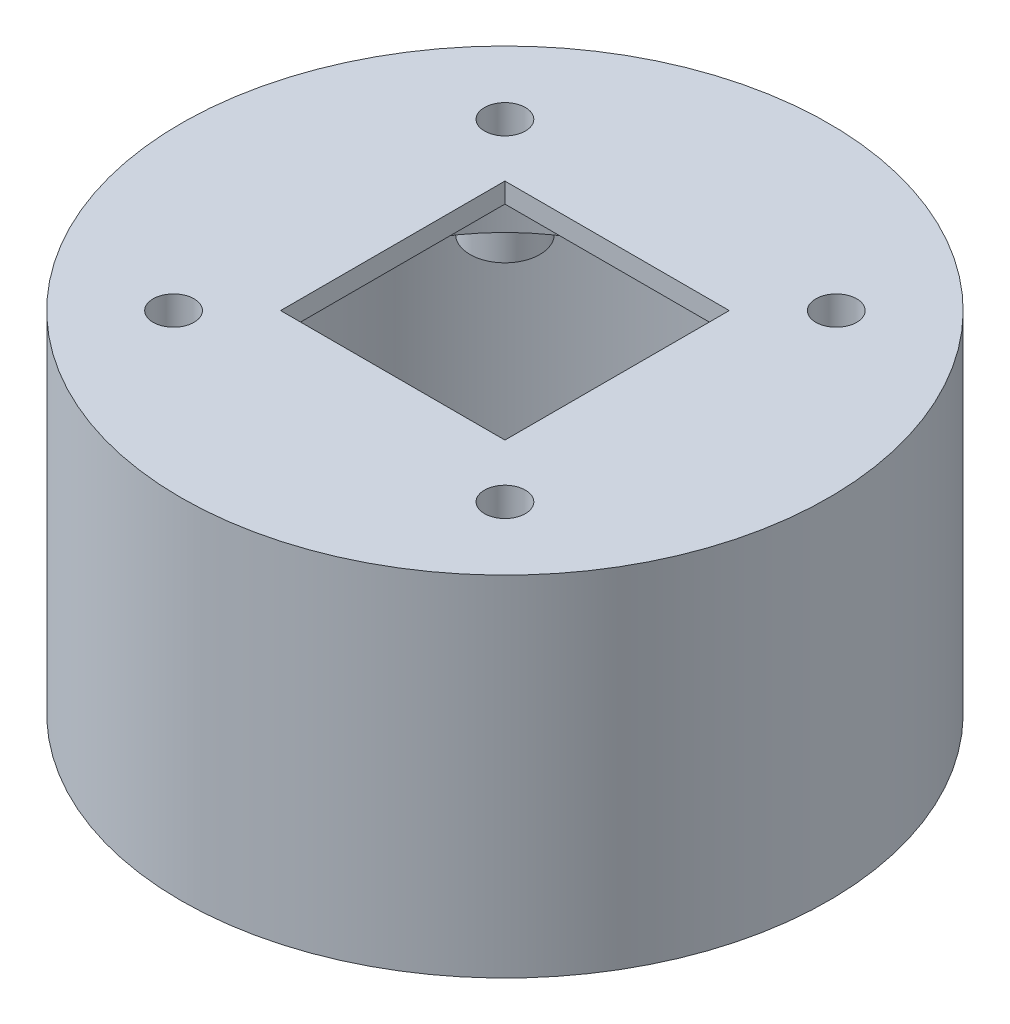
ISO-10303-21;
HEADER;
FILE_DESCRIPTION(('STEP AP214'),'2;1');
FILE_NAME('part.step','',(''),(''),'','','');
FILE_SCHEMA(('AUTOMOTIVE_DESIGN { 1 0 10303 214 1 1 1 1 }'));
ENDSEC;
DATA;
#1=APPLICATION_CONTEXT('core data for automotive mechanical design processes');
#2=APPLICATION_PROTOCOL_DEFINITION('international standard','automotive_design',2000,#1);
#3=PRODUCT_CONTEXT('',#1,'mechanical');
#4=PRODUCT('Part','Part','',(#3));
#5=PRODUCT_RELATED_PRODUCT_CATEGORY('part','',(#4));
#6=PRODUCT_DEFINITION_FORMATION('','',#4);
#7=PRODUCT_DEFINITION_CONTEXT('part definition',#1,'design');
#8=PRODUCT_DEFINITION('design','',#6,#7);
#9=PRODUCT_DEFINITION_SHAPE('','',#8);
#10=(LENGTH_UNIT() NAMED_UNIT(*) SI_UNIT(.MILLI.,.METRE.));
#11=(NAMED_UNIT(*) PLANE_ANGLE_UNIT() SI_UNIT($,.RADIAN.));
#12=(NAMED_UNIT(*) SI_UNIT($,.STERADIAN.) SOLID_ANGLE_UNIT());
#13=UNCERTAINTY_MEASURE_WITH_UNIT(LENGTH_MEASURE(1.E-05),#10,'distance_accuracy_value','');
#14=(GEOMETRIC_REPRESENTATION_CONTEXT(3) GLOBAL_UNCERTAINTY_ASSIGNED_CONTEXT((#13)) GLOBAL_UNIT_ASSIGNED_CONTEXT((#10,
#11,#12)) REPRESENTATION_CONTEXT('',''));
#15=CARTESIAN_POINT('',(0.,0.,0.));
#16=DIRECTION('',(0.,0.,1.));
#17=DIRECTION('',(1.,0.,0.));
#18=AXIS2_PLACEMENT_3D('',#15,#16,#17);
#19=CARTESIAN_POINT('',(22.5,0.,-22.5));
#20=DIRECTION('',(0.,0.,-1.));
#21=DIRECTION('',(-1.,0.,0.));
#22=AXIS2_PLACEMENT_3D('',#19,#20,#21);
#23=PLANE('',#22);
#24=DIRECTION('',(-1.,0.,0.));
#25=VECTOR('',#24,1.);
#26=CARTESIAN_POINT('',(22.5,66.,-22.5));
#27=LINE('',#26,#25);
#28=CARTESIAN_POINT('',(22.5,66.,-22.5));
#29=VERTEX_POINT('',#28);
#30=CARTESIAN_POINT('',(-22.5,66.,-22.5));
#31=VERTEX_POINT('',#30);
#32=EDGE_CURVE('E387',#29,#31,#27,.T.);
#33=ORIENTED_EDGE('',*,*,#32,.F.);
#34=DIRECTION('',(0.,1.,0.));
#35=VECTOR('',#34,1.);
#36=CARTESIAN_POINT('',(22.5,0.,-22.5));
#37=LINE('',#36,#35);
#38=CARTESIAN_POINT('',(22.5,70.,-22.5));
#39=VERTEX_POINT('',#38);
#40=EDGE_CURVE('E248',#29,#39,#37,.T.);
#41=ORIENTED_EDGE('',*,*,#40,.T.);
#42=DIRECTION('',(-1.,0.,0.));
#43=VECTOR('',#42,1.);
#44=CARTESIAN_POINT('',(22.5,70.,-22.5));
#45=LINE('',#44,#43);
#46=CARTESIAN_POINT('',(-22.5,70.,-22.5));
#47=VERTEX_POINT('',#46);
#48=EDGE_CURVE('E243',#39,#47,#45,.T.);
#49=ORIENTED_EDGE('',*,*,#48,.T.);
#50=DIRECTION('',(0.,1.,0.));
#51=VECTOR('',#50,1.);
#52=CARTESIAN_POINT('',(-22.5,0.,-22.5));
#53=LINE('',#52,#51);
#54=EDGE_CURVE('E234',#31,#47,#53,.T.);
#55=ORIENTED_EDGE('',*,*,#54,.F.);
#56=EDGE_LOOP('',(#33,#41,#49,#55));
#57=FACE_BOUND('',#56,.T.);
#58=ADVANCED_FACE('F35',(#57),#23,.F.);
#59=CARTESIAN_POINT('',(22.5,0.,22.5));
#60=DIRECTION('',(0.,0.,1.));
#61=DIRECTION('',(1.,0.,0.));
#62=AXIS2_PLACEMENT_3D('',#59,#60,#61);
#63=PLANE('',#62);
#64=DIRECTION('',(1.,0.,0.));
#65=VECTOR('',#64,1.);
#66=CARTESIAN_POINT('',(22.5,66.,22.5));
#67=LINE('',#66,#65);
#68=CARTESIAN_POINT('',(-22.5,66.,22.5));
#69=VERTEX_POINT('',#68);
#70=CARTESIAN_POINT('',(22.5,66.,22.5));
#71=VERTEX_POINT('',#70);
#72=EDGE_CURVE('E49',#69,#71,#67,.T.);
#73=ORIENTED_EDGE('',*,*,#72,.F.);
#74=DIRECTION('',(0.,1.,0.));
#75=VECTOR('',#74,1.);
#76=CARTESIAN_POINT('',(-22.5,0.,22.5));
#77=LINE('',#76,#75);
#78=CARTESIAN_POINT('',(-22.5,70.,22.5));
#79=VERTEX_POINT('',#78);
#80=EDGE_CURVE('E246',#69,#79,#77,.T.);
#81=ORIENTED_EDGE('',*,*,#80,.T.);
#82=DIRECTION('',(1.,0.,0.));
#83=VECTOR('',#82,1.);
#84=CARTESIAN_POINT('',(22.5,70.,22.5));
#85=LINE('',#84,#83);
#86=CARTESIAN_POINT('',(22.5,70.,22.5));
#87=VERTEX_POINT('',#86);
#88=EDGE_CURVE('E237',#79,#87,#85,.T.);
#89=ORIENTED_EDGE('',*,*,#88,.T.);
#90=DIRECTION('',(0.,1.,0.));
#91=VECTOR('',#90,1.);
#92=CARTESIAN_POINT('',(22.5,0.,22.5));
#93=LINE('',#92,#91);
#94=EDGE_CURVE('E250',#71,#87,#93,.T.);
#95=ORIENTED_EDGE('',*,*,#94,.F.);
#96=EDGE_LOOP('',(#73,#81,#89,#95));
#97=FACE_BOUND('',#96,.T.);
#98=ADVANCED_FACE('F404',(#97),#63,.F.);
#99=CARTESIAN_POINT('',(-22.5,0.,-22.5));
#100=DIRECTION('',(-1.,0.,0.));
#101=DIRECTION('',(0.,0.,1.));
#102=AXIS2_PLACEMENT_3D('',#99,#100,#101);
#103=PLANE('',#102);
#104=DIRECTION('',(0.,0.,1.));
#105=VECTOR('',#104,1.);
#106=CARTESIAN_POINT('',(-22.5,66.,-22.5));
#107=LINE('',#106,#105);
#108=EDGE_CURVE('E383',#31,#69,#107,.T.);
#109=ORIENTED_EDGE('',*,*,#108,.F.);
#110=ORIENTED_EDGE('',*,*,#54,.T.);
#111=DIRECTION('',(0.,0.,1.));
#112=VECTOR('',#111,1.);
#113=CARTESIAN_POINT('',(-22.5,70.,-22.5));
#114=LINE('',#113,#112);
#115=EDGE_CURVE('E221',#47,#79,#114,.T.);
#116=ORIENTED_EDGE('',*,*,#115,.T.);
#117=ORIENTED_EDGE('',*,*,#80,.F.);
#118=EDGE_LOOP('',(#109,#110,#116,#117));
#119=FACE_BOUND('',#118,.T.);
#120=ADVANCED_FACE('F410',(#119),#103,.F.);
#121=CARTESIAN_POINT('',(22.5,0.,-22.5));
#122=DIRECTION('',(1.,0.,0.));
#123=DIRECTION('',(0.,0.,-1.));
#124=AXIS2_PLACEMENT_3D('',#121,#122,#123);
#125=PLANE('',#124);
#126=DIRECTION('',(0.,0.,-1.));
#127=VECTOR('',#126,1.);
#128=CARTESIAN_POINT('',(22.5,66.,-22.5));
#129=LINE('',#128,#127);
#130=EDGE_CURVE('E11',#71,#29,#129,.T.);
#131=ORIENTED_EDGE('',*,*,#130,.F.);
#132=ORIENTED_EDGE('',*,*,#94,.T.);
#133=DIRECTION('',(0.,0.,-1.));
#134=VECTOR('',#133,1.);
#135=CARTESIAN_POINT('',(22.5,70.,-22.5));
#136=LINE('',#135,#134);
#137=EDGE_CURVE('E240',#87,#39,#136,.T.);
#138=ORIENTED_EDGE('',*,*,#137,.T.);
#139=ORIENTED_EDGE('',*,*,#40,.F.);
#140=EDGE_LOOP('',(#131,#132,#138,#139));
#141=FACE_BOUND('',#140,.T.);
#142=ADVANCED_FACE('F419',(#141),#125,.F.);
#143=CARTESIAN_POINT('',(0.,56.,0.));
#144=DIRECTION('',(0.,-1.,0.));
#145=DIRECTION('',(0.,0.,-1.));
#146=AXIS2_PLACEMENT_3D('',#143,#144,#145);
#147=PLANE('',#146);
#148=CARTESIAN_POINT('',(0.,56.,0.));
#149=DIRECTION('',(0.,-1.,0.));
#150=DIRECTION('',(0.,0.,-1.));
#151=AXIS2_PLACEMENT_3D('',#148,#149,#150);
#152=CIRCLE('',#151,39.);
#153=CARTESIAN_POINT('',(-22.5,56.,31.855140872393));
#154=VERTEX_POINT('',#153);
#155=CARTESIAN_POINT('',(22.5,56.,31.855140872393));
#156=VERTEX_POINT('',#155);
#157=EDGE_CURVE('E169',#154,#156,#152,.T.);
#158=ORIENTED_EDGE('',*,*,#157,.F.);
#159=DIRECTION('',(0.,0.,1.));
#160=VECTOR('',#159,1.);
#161=CARTESIAN_POINT('',(-22.5,56.,-22.5));
#162=LINE('',#161,#160);
#163=CARTESIAN_POINT('',(-22.5,56.,44.6514277487294));
#164=VERTEX_POINT('',#163);
#165=EDGE_CURVE('E191',#154,#164,#162,.T.);
#166=ORIENTED_EDGE('',*,*,#165,.T.);
#167=CARTESIAN_POINT('',(0.,56.,0.));
#168=DIRECTION('',(0.,-1.,0.));
#169=DIRECTION('',(0.,0.,-1.));
#170=AXIS2_PLACEMENT_3D('',#167,#168,#169);
#171=CIRCLE('',#170,50.);
#172=CARTESIAN_POINT('',(-30.4516111412089,56.,39.6572739721808));
#173=VERTEX_POINT('',#172);
#174=EDGE_CURVE('E349',#164,#173,#171,.T.);
#175=ORIENTED_EDGE('',*,*,#174,.T.);
#176=CARTESIAN_POINT('',(-33.2340187157677,56.,33.2340187157677));
#177=DIRECTION('',(0.,-1.,0.));
#178=DIRECTION('',(0.,0.,-1.));
#179=AXIS2_PLACEMENT_3D('',#176,#177,#178);
#180=CIRCLE('',#179,7.);
#181=CARTESIAN_POINT('',(-39.6572739721807,56.,30.4516111412089));
#182=VERTEX_POINT('',#181);
#183=EDGE_CURVE('E365',#182,#173,#180,.T.);
#184=ORIENTED_EDGE('',*,*,#183,.F.);
#185=CARTESIAN_POINT('',(-39.6572739721807,56.,-30.4516111412089));
#186=VERTEX_POINT('',#185);
#187=EDGE_CURVE('E198',#182,#186,#171,.T.);
#188=ORIENTED_EDGE('',*,*,#187,.T.);
#189=CARTESIAN_POINT('',(-33.2340187157677,56.,-33.2340187157677));
#190=DIRECTION('',(0.,-1.,0.));
#191=DIRECTION('',(0.,0.,-1.));
#192=AXIS2_PLACEMENT_3D('',#189,#190,#191);
#193=CIRCLE('',#192,7.);
#194=CARTESIAN_POINT('',(-30.4516111412089,56.,-39.6572739721807));
#195=VERTEX_POINT('',#194);
#196=EDGE_CURVE('E356',#195,#186,#193,.T.);
#197=ORIENTED_EDGE('',*,*,#196,.F.);
#198=CARTESIAN_POINT('',(30.4516111412089,56.,-39.6572739721808));
#199=VERTEX_POINT('',#198);
#200=EDGE_CURVE('E334',#195,#199,#171,.T.);
#201=ORIENTED_EDGE('',*,*,#200,.T.);
#202=CARTESIAN_POINT('',(33.2340187157677,56.,-33.2340187157677));
#203=DIRECTION('',(0.,-1.,0.));
#204=DIRECTION('',(0.,0.,-1.));
#205=AXIS2_PLACEMENT_3D('',#202,#203,#204);
#206=CIRCLE('',#205,7.);
#207=CARTESIAN_POINT('',(39.6572739721807,56.,-30.4516111412089));
#208=VERTEX_POINT('',#207);
#209=EDGE_CURVE('E372',#208,#199,#206,.T.);
#210=ORIENTED_EDGE('',*,*,#209,.F.);
#211=CARTESIAN_POINT('',(39.6572739721808,56.,30.4516111412089));
#212=VERTEX_POINT('',#211);
#213=EDGE_CURVE('E192',#208,#212,#171,.T.);
#214=ORIENTED_EDGE('',*,*,#213,.T.);
#215=CARTESIAN_POINT('',(33.2340187157677,56.,33.2340187157677));
#216=DIRECTION('',(0.,-1.,0.));
#217=DIRECTION('',(0.,0.,-1.));
#218=AXIS2_PLACEMENT_3D('',#215,#216,#217);
#219=CIRCLE('',#218,7.);
#220=CARTESIAN_POINT('',(30.4516111412089,56.,39.6572739721807));
#221=VERTEX_POINT('',#220);
#222=EDGE_CURVE('E380',#221,#212,#219,.T.);
#223=ORIENTED_EDGE('',*,*,#222,.F.);
#224=CARTESIAN_POINT('',(22.5,56.,44.6514277487294));
#225=VERTEX_POINT('',#224);
#226=EDGE_CURVE('E189',#221,#225,#171,.T.);
#227=ORIENTED_EDGE('',*,*,#226,.T.);
#228=DIRECTION('',(0.,0.,-1.));
#229=VECTOR('',#228,1.);
#230=CARTESIAN_POINT('',(22.5,56.,-22.5));
#231=LINE('',#230,#229);
#232=EDGE_CURVE('E183',#225,#156,#231,.T.);
#233=ORIENTED_EDGE('',*,*,#232,.T.);
#234=EDGE_LOOP('',(#158,#166,#175,#184,#188,#197,#201,#210,#214,#223,#227,#233));
#235=FACE_BOUND('',#234,.T.);
#236=ADVANCED_FACE('F187',(#235),#147,.T.);
#237=CARTESIAN_POINT('',(0.,56.,0.));
#238=DIRECTION('',(0.,-1.,0.));
#239=DIRECTION('',(0.,0.,-1.));
#240=AXIS2_PLACEMENT_3D('',#237,#238,#239);
#241=CYLINDRICAL_SURFACE('',#240,50.);
#242=DIRECTION('',(0.,1.,0.));
#243=VECTOR('',#242,1.);
#244=CARTESIAN_POINT('',(39.6572739721808,53.,30.4516111412089));
#245=LINE('',#244,#243);
#246=CARTESIAN_POINT('',(39.6572739721807,50.,30.4516111412089));
#247=VERTEX_POINT('',#246);
#248=EDGE_CURVE('E376',#212,#247,#245,.F.);
#249=ORIENTED_EDGE('',*,*,#248,.F.);
#250=ORIENTED_EDGE('',*,*,#213,.F.);
#251=DIRECTION('',(0.,1.,0.));
#252=VECTOR('',#251,1.);
#253=CARTESIAN_POINT('',(39.6572739721807,53.,-30.4516111412089));
#254=LINE('',#253,#252);
#255=CARTESIAN_POINT('',(39.6572739721807,50.,-30.4516111412089));
#256=VERTEX_POINT('',#255);
#257=EDGE_CURVE('E295',#256,#208,#254,.T.);
#258=ORIENTED_EDGE('',*,*,#257,.F.);
#259=CARTESIAN_POINT('',(0.,50.,0.));
#260=DIRECTION('',(0.,-1.,0.));
#261=DIRECTION('',(0.,0.,-1.));
#262=AXIS2_PLACEMENT_3D('',#259,#260,#261);
#263=CIRCLE('',#262,50.);
#264=EDGE_CURVE('E329',#256,#247,#263,.T.);
#265=ORIENTED_EDGE('',*,*,#264,.T.);
#266=EDGE_LOOP('',(#249,#250,#258,#265));
#267=FACE_BOUND('',#266,.T.);
#268=ADVANCED_FACE('F459',(#267),#241,.F.);
#269=DIRECTION('',(0.,1.,0.));
#270=VECTOR('',#269,1.);
#271=CARTESIAN_POINT('',(30.4516111412089,53.,39.6572739721807));
#272=LINE('',#271,#270);
#273=CARTESIAN_POINT('',(30.4516111412089,50.,39.6572739721807));
#274=VERTEX_POINT('',#273);
#275=EDGE_CURVE('E298',#274,#221,#272,.T.);
#276=ORIENTED_EDGE('',*,*,#275,.F.);
#277=CARTESIAN_POINT('',(22.5,50.,44.6514277487294));
#278=VERTEX_POINT('',#277);
#279=EDGE_CURVE('E328',#274,#278,#263,.T.);
#280=ORIENTED_EDGE('',*,*,#279,.T.);
#281=DIRECTION('',(0.,-1.,0.));
#282=VECTOR('',#281,1.);
#283=CARTESIAN_POINT('',(22.5,56.,44.6514277487294));
#284=LINE('',#283,#282);
#285=EDGE_CURVE('E194',#225,#278,#284,.T.);
#286=ORIENTED_EDGE('',*,*,#285,.F.);
#287=ORIENTED_EDGE('',*,*,#226,.F.);
#288=EDGE_LOOP('',(#276,#280,#286,#287));
#289=FACE_BOUND('',#288,.T.);
#290=ADVANCED_FACE('F342',(#289),#241,.F.);
#291=DIRECTION('',(0.,1.,0.));
#292=VECTOR('',#291,1.);
#293=CARTESIAN_POINT('',(30.4516111412089,53.,-39.6572739721808));
#294=LINE('',#293,#292);
#295=CARTESIAN_POINT('',(30.4516111412089,50.,-39.6572739721807));
#296=VERTEX_POINT('',#295);
#297=EDGE_CURVE('E367',#199,#296,#294,.F.);
#298=ORIENTED_EDGE('',*,*,#297,.F.);
#299=ORIENTED_EDGE('',*,*,#200,.F.);
#300=DIRECTION('',(0.,1.,0.));
#301=VECTOR('',#300,1.);
#302=CARTESIAN_POINT('',(-30.4516111412089,53.,-39.6572739721808));
#303=LINE('',#302,#301);
#304=CARTESIAN_POINT('',(-30.4516111412089,50.,-39.6572739721807));
#305=VERTEX_POINT('',#304);
#306=EDGE_CURVE('E353',#305,#195,#303,.T.);
#307=ORIENTED_EDGE('',*,*,#306,.F.);
#308=EDGE_CURVE('E200',#305,#296,#263,.T.);
#309=ORIENTED_EDGE('',*,*,#308,.T.);
#310=EDGE_LOOP('',(#298,#299,#307,#309));
#311=FACE_BOUND('',#310,.T.);
#312=ADVANCED_FACE('F448',(#311),#241,.F.);
#313=DIRECTION('',(0.,1.,0.));
#314=VECTOR('',#313,1.);
#315=CARTESIAN_POINT('',(-39.6572739721807,53.,30.4516111412089));
#316=LINE('',#315,#314);
#317=CARTESIAN_POINT('',(-39.6572739721807,50.,30.4516111412089));
#318=VERTEX_POINT('',#317);
#319=EDGE_CURVE('E360',#318,#182,#316,.T.);
#320=ORIENTED_EDGE('',*,*,#319,.F.);
#321=CARTESIAN_POINT('',(-39.6572739721807,50.,-30.4516111412089));
#322=VERTEX_POINT('',#321);
#323=EDGE_CURVE('E327',#318,#322,#263,.T.);
#324=ORIENTED_EDGE('',*,*,#323,.T.);
#325=DIRECTION('',(0.,1.,0.));
#326=VECTOR('',#325,1.);
#327=CARTESIAN_POINT('',(-39.6572739721807,53.,-30.4516111412089));
#328=LINE('',#327,#326);
#329=EDGE_CURVE('E333',#186,#322,#328,.F.);
#330=ORIENTED_EDGE('',*,*,#329,.F.);
#331=ORIENTED_EDGE('',*,*,#187,.F.);
#332=EDGE_LOOP('',(#320,#324,#330,#331));
#333=FACE_BOUND('',#332,.T.);
#334=ADVANCED_FACE('F446',(#333),#241,.F.);
#335=DIRECTION('',(0.,1.,0.));
#336=VECTOR('',#335,1.);
#337=CARTESIAN_POINT('',(-30.4516111412089,53.,39.6572739721808));
#338=LINE('',#337,#336);
#339=CARTESIAN_POINT('',(-30.4516111412089,50.,39.6572739721807));
#340=VERTEX_POINT('',#339);
#341=EDGE_CURVE('E292',#173,#340,#338,.F.);
#342=ORIENTED_EDGE('',*,*,#341,.F.);
#343=ORIENTED_EDGE('',*,*,#174,.F.);
#344=DIRECTION('',(0.,-1.,0.));
#345=VECTOR('',#344,1.);
#346=CARTESIAN_POINT('',(-22.5,56.,44.6514277487294));
#347=LINE('',#346,#345);
#348=CARTESIAN_POINT('',(-22.5,50.,44.6514277487294));
#349=VERTEX_POINT('',#348);
#350=EDGE_CURVE('E203',#349,#164,#347,.F.);
#351=ORIENTED_EDGE('',*,*,#350,.F.);
#352=EDGE_CURVE('E321',#349,#340,#263,.T.);
#353=ORIENTED_EDGE('',*,*,#352,.T.);
#354=EDGE_LOOP('',(#342,#343,#351,#353));
#355=FACE_BOUND('',#354,.T.);
#356=ADVANCED_FACE('F439',(#355),#241,.F.);
#357=CARTESIAN_POINT('',(0.,0.,0.));
#358=DIRECTION('',(0.,1.,0.));
#359=DIRECTION('',(0.,0.,1.));
#360=AXIS2_PLACEMENT_3D('',#357,#358,#359);
#361=PLANE('',#360);
#362=CARTESIAN_POINT('',(0.,0.,0.));
#363=DIRECTION('',(0.,1.,0.));
#364=DIRECTION('',(0.,0.,1.));
#365=AXIS2_PLACEMENT_3D('',#362,#363,#364);
#366=CIRCLE('',#365,65.);
#367=CARTESIAN_POINT('',(0.,0.,65.));
#368=VERTEX_POINT('',#367);
#369=EDGE_CURVE('E281',#368,#368,#366,.T.);
#370=ORIENTED_EDGE('',*,*,#369,.F.);
#371=EDGE_LOOP('',(#370));
#372=FACE_BOUND('',#371,.T.);
#373=CARTESIAN_POINT('',(0.,0.,0.));
#374=DIRECTION('',(0.,1.,0.));
#375=DIRECTION('',(0.,0.,1.));
#376=AXIS2_PLACEMENT_3D('',#373,#374,#375);
#377=CIRCLE('',#376,60.);
#378=CARTESIAN_POINT('',(0.,0.,60.));
#379=VERTEX_POINT('',#378);
#380=EDGE_CURVE('E278',#379,#379,#377,.T.);
#381=ORIENTED_EDGE('',*,*,#380,.T.);
#382=EDGE_LOOP('',(#381));
#383=FACE_BOUND('',#382,.T.);
#384=ADVANCED_FACE('F437',(#372,#383),#361,.F.);
#385=CARTESIAN_POINT('',(0.,50.,0.));
#386=DIRECTION('',(0.,-1.,0.));
#387=DIRECTION('',(0.,0.,-1.));
#388=AXIS2_PLACEMENT_3D('',#385,#386,#387);
#389=CYLINDRICAL_SURFACE('',#388,65.);
#390=ORIENTED_EDGE('',*,*,#369,.T.);
#391=EDGE_LOOP('',(#390));
#392=FACE_BOUND('',#391,.T.);
#393=CARTESIAN_POINT('',(0.,70.,0.));
#394=DIRECTION('',(0.,1.,0.));
#395=DIRECTION('',(0.,0.,1.));
#396=AXIS2_PLACEMENT_3D('',#393,#394,#395);
#397=CIRCLE('',#396,65.);
#398=CARTESIAN_POINT('',(0.,70.,65.));
#399=VERTEX_POINT('',#398);
#400=EDGE_CURVE('E272',#399,#399,#397,.T.);
#401=ORIENTED_EDGE('',*,*,#400,.F.);
#402=EDGE_LOOP('',(#401));
#403=FACE_BOUND('',#402,.T.);
#404=ADVANCED_FACE('F37',(#392,#403),#389,.T.);
#405=CARTESIAN_POINT('',(0.,50.,0.));
#406=DIRECTION('',(0.,-1.,0.));
#407=DIRECTION('',(0.,0.,-1.));
#408=AXIS2_PLACEMENT_3D('',#405,#406,#407);
#409=CYLINDRICAL_SURFACE('',#408,60.);
#410=CARTESIAN_POINT('',(0.,50.,0.));
#411=DIRECTION('',(0.,1.,0.));
#412=DIRECTION('',(0.,0.,1.));
#413=AXIS2_PLACEMENT_3D('',#410,#411,#412);
#414=CIRCLE('',#413,60.);
#415=CARTESIAN_POINT('',(0.,50.,60.));
#416=VERTEX_POINT('',#415);
#417=EDGE_CURVE('E275',#416,#416,#414,.T.);
#418=ORIENTED_EDGE('',*,*,#417,.T.);
#419=EDGE_LOOP('',(#418));
#420=FACE_BOUND('',#419,.T.);
#421=ORIENTED_EDGE('',*,*,#380,.F.);
#422=EDGE_LOOP('',(#421));
#423=FACE_BOUND('',#422,.T.);
#424=ADVANCED_FACE('F433',(#420,#423),#409,.F.);
#425=CARTESIAN_POINT('',(0.,50.,0.));
#426=DIRECTION('',(0.,1.,0.));
#427=DIRECTION('',(0.,0.,1.));
#428=AXIS2_PLACEMENT_3D('',#425,#426,#427);
#429=PLANE('',#428);
#430=CARTESIAN_POINT('',(33.2340187157677,50.,33.2340187157677));
#431=DIRECTION('',(0.,1.,0.));
#432=DIRECTION('',(0.,0.,1.));
#433=AXIS2_PLACEMENT_3D('',#430,#431,#432);
#434=CIRCLE('',#433,4.1);
#435=CARTESIAN_POINT('',(33.2340187157677,50.,37.3340187157677));
#436=VERTEX_POINT('',#435);
#437=EDGE_CURVE('E257',#436,#436,#434,.T.);
#438=ORIENTED_EDGE('',*,*,#437,.T.);
#439=EDGE_LOOP('',(#438));
#440=FACE_BOUND('',#439,.T.);
#441=CARTESIAN_POINT('',(33.2340187157677,50.,33.2340187157677));
#442=DIRECTION('',(0.,1.,0.));
#443=DIRECTION('',(0.,0.,1.));
#444=AXIS2_PLACEMENT_3D('',#441,#442,#443);
#445=CIRCLE('',#444,7.);
#446=EDGE_CURVE('E381',#247,#274,#445,.T.);
#447=ORIENTED_EDGE('',*,*,#446,.F.);
#448=ORIENTED_EDGE('',*,*,#264,.F.);
#449=CARTESIAN_POINT('',(33.2340187157677,50.,-33.2340187157677));
#450=DIRECTION('',(0.,1.,0.));
#451=DIRECTION('',(0.,0.,1.));
#452=AXIS2_PLACEMENT_3D('',#449,#450,#451);
#453=CIRCLE('',#452,7.);
#454=EDGE_CURVE('E373',#296,#256,#453,.T.);
#455=ORIENTED_EDGE('',*,*,#454,.F.);
#456=ORIENTED_EDGE('',*,*,#308,.F.);
#457=CARTESIAN_POINT('',(-33.2340187157677,50.,-33.2340187157677));
#458=DIRECTION('',(0.,1.,0.));
#459=DIRECTION('',(0.,0.,1.));
#460=AXIS2_PLACEMENT_3D('',#457,#458,#459);
#461=CIRCLE('',#460,7.);
#462=EDGE_CURVE('E357',#322,#305,#461,.T.);
#463=ORIENTED_EDGE('',*,*,#462,.F.);
#464=ORIENTED_EDGE('',*,*,#323,.F.);
#465=CARTESIAN_POINT('',(-33.2340187157677,50.,33.2340187157677));
#466=DIRECTION('',(0.,1.,0.));
#467=DIRECTION('',(0.,0.,1.));
#468=AXIS2_PLACEMENT_3D('',#465,#466,#467);
#469=CIRCLE('',#468,7.);
#470=EDGE_CURVE('E324',#340,#318,#469,.T.);
#471=ORIENTED_EDGE('',*,*,#470,.F.);
#472=ORIENTED_EDGE('',*,*,#352,.F.);
#473=DIRECTION('',(0.,0.,1.));
#474=VECTOR('',#473,1.);
#475=CARTESIAN_POINT('',(-22.5,50.,0.));
#476=LINE('',#475,#474);
#477=CARTESIAN_POINT('',(-22.5,50.,47.5));
#478=VERTEX_POINT('',#477);
#479=EDGE_CURVE('E255',#349,#478,#476,.T.);
#480=ORIENTED_EDGE('',*,*,#479,.T.);
#481=DIRECTION('',(-1.,0.,0.));
#482=VECTOR('',#481,1.);
#483=CARTESIAN_POINT('',(-22.5,50.,47.5));
#484=LINE('',#483,#482);
#485=CARTESIAN_POINT('',(-15.612494995996,50.,47.5));
#486=VERTEX_POINT('',#485);
#487=EDGE_CURVE('E206',#486,#478,#484,.T.);
#488=ORIENTED_EDGE('',*,*,#487,.F.);
#489=CARTESIAN_POINT('',(15.612494995996,50.,47.5));
#490=VERTEX_POINT('',#489);
#491=EDGE_CURVE('E326',#490,#486,#263,.T.);
#492=ORIENTED_EDGE('',*,*,#491,.F.);
#493=CARTESIAN_POINT('',(22.5,50.,47.5));
#494=VERTEX_POINT('',#493);
#495=EDGE_CURVE('E209',#494,#490,#484,.T.);
#496=ORIENTED_EDGE('',*,*,#495,.F.);
#497=DIRECTION('',(0.,0.,-1.));
#498=VECTOR('',#497,1.);
#499=CARTESIAN_POINT('',(22.5,50.,0.));
#500=LINE('',#499,#498);
#501=EDGE_CURVE('E227',#494,#278,#500,.T.);
#502=ORIENTED_EDGE('',*,*,#501,.T.);
#503=ORIENTED_EDGE('',*,*,#279,.F.);
#504=EDGE_LOOP('',(#447,#448,#455,#456,#463,#464,#471,#472,#480,#488,#492,#496,#502,#503));
#505=FACE_BOUND('',#504,.T.);
#506=CARTESIAN_POINT('',(-33.2340187157677,50.,33.2340187157677));
#507=DIRECTION('',(0.,1.,0.));
#508=DIRECTION('',(0.,0.,1.));
#509=AXIS2_PLACEMENT_3D('',#506,#507,#508);
#510=CIRCLE('',#509,4.1);
#511=CARTESIAN_POINT('',(-33.2340187157677,50.,37.3340187157677));
#512=VERTEX_POINT('',#511);
#513=EDGE_CURVE('E269',#512,#512,#510,.T.);
#514=ORIENTED_EDGE('',*,*,#513,.T.);
#515=EDGE_LOOP('',(#514));
#516=FACE_BOUND('',#515,.T.);
#517=ORIENTED_EDGE('',*,*,#417,.F.);
#518=EDGE_LOOP('',(#517));
#519=FACE_BOUND('',#518,.T.);
#520=CARTESIAN_POINT('',(-33.2340187157677,50.,-33.2340187157677));
#521=DIRECTION('',(0.,1.,0.));
#522=DIRECTION('',(0.,0.,1.));
#523=AXIS2_PLACEMENT_3D('',#520,#521,#522);
#524=CIRCLE('',#523,4.1);
#525=CARTESIAN_POINT('',(-33.2340187157677,50.,-29.1340187157677));
#526=VERTEX_POINT('',#525);
#527=EDGE_CURVE('E263',#526,#526,#524,.T.);
#528=ORIENTED_EDGE('',*,*,#527,.T.);
#529=EDGE_LOOP('',(#528));
#530=FACE_BOUND('',#529,.T.);
#531=CARTESIAN_POINT('',(33.2340187157677,50.,-33.2340187157677));
#532=DIRECTION('',(0.,1.,0.));
#533=DIRECTION('',(0.,0.,1.));
#534=AXIS2_PLACEMENT_3D('',#531,#532,#533);
#535=CIRCLE('',#534,4.1);
#536=CARTESIAN_POINT('',(33.2340187157677,50.,-29.1340187157677));
#537=VERTEX_POINT('',#536);
#538=EDGE_CURVE('E260',#537,#537,#535,.T.);
#539=ORIENTED_EDGE('',*,*,#538,.T.);
#540=EDGE_LOOP('',(#539));
#541=FACE_BOUND('',#540,.T.);
#542=ADVANCED_FACE('F317',(#440,#505,#516,#519,#530,#541),#429,.F.);
#543=CARTESIAN_POINT('',(0.,70.,0.));
#544=DIRECTION('',(0.,1.,0.));
#545=DIRECTION('',(0.,0.,1.));
#546=AXIS2_PLACEMENT_3D('',#543,#544,#545);
#547=PLANE('',#546);
#548=CARTESIAN_POINT('',(-33.2340187157677,70.,-33.2340187157677));
#549=DIRECTION('',(0.,1.,0.));
#550=DIRECTION('',(0.,0.,1.));
#551=AXIS2_PLACEMENT_3D('',#548,#549,#550);
#552=CIRCLE('',#551,4.1);
#553=CARTESIAN_POINT('',(-33.2340187157677,70.,-29.1340187157677));
#554=VERTEX_POINT('',#553);
#555=EDGE_CURVE('E224',#554,#554,#552,.T.);
#556=ORIENTED_EDGE('',*,*,#555,.F.);
#557=EDGE_LOOP('',(#556));
#558=FACE_BOUND('',#557,.T.);
#559=CARTESIAN_POINT('',(33.2340187157677,70.,-33.2340187157677));
#560=DIRECTION('',(0.,1.,0.));
#561=DIRECTION('',(0.,0.,1.));
#562=AXIS2_PLACEMENT_3D('',#559,#560,#561);
#563=CIRCLE('',#562,4.1);
#564=CARTESIAN_POINT('',(33.2340187157677,70.,-29.1340187157677));
#565=VERTEX_POINT('',#564);
#566=EDGE_CURVE('E228',#565,#565,#563,.T.);
#567=ORIENTED_EDGE('',*,*,#566,.F.);
#568=EDGE_LOOP('',(#567));
#569=FACE_BOUND('',#568,.T.);
#570=CARTESIAN_POINT('',(33.2340187157677,70.,33.2340187157677));
#571=DIRECTION('',(0.,1.,0.));
#572=DIRECTION('',(0.,0.,1.));
#573=AXIS2_PLACEMENT_3D('',#570,#571,#572);
#574=CIRCLE('',#573,4.1);
#575=CARTESIAN_POINT('',(33.2340187157677,70.,37.3340187157677));
#576=VERTEX_POINT('',#575);
#577=EDGE_CURVE('E231',#576,#576,#574,.T.);
#578=ORIENTED_EDGE('',*,*,#577,.F.);
#579=EDGE_LOOP('',(#578));
#580=FACE_BOUND('',#579,.T.);
#581=ORIENTED_EDGE('',*,*,#115,.F.);
#582=ORIENTED_EDGE('',*,*,#48,.F.);
#583=ORIENTED_EDGE('',*,*,#137,.F.);
#584=ORIENTED_EDGE('',*,*,#88,.F.);
#585=EDGE_LOOP('',(#581,#582,#583,#584));
#586=FACE_BOUND('',#585,.T.);
#587=CARTESIAN_POINT('',(-33.2340187157677,70.,33.2340187157677));
#588=DIRECTION('',(0.,1.,0.));
#589=DIRECTION('',(0.,0.,1.));
#590=AXIS2_PLACEMENT_3D('',#587,#588,#589);
#591=CIRCLE('',#590,4.1);
#592=CARTESIAN_POINT('',(-33.2340187157677,70.,37.3340187157677));
#593=VERTEX_POINT('',#592);
#594=EDGE_CURVE('E266',#593,#593,#591,.T.);
#595=ORIENTED_EDGE('',*,*,#594,.F.);
#596=EDGE_LOOP('',(#595));
#597=FACE_BOUND('',#596,.T.);
#598=ORIENTED_EDGE('',*,*,#400,.T.);
#599=EDGE_LOOP('',(#598));
#600=FACE_BOUND('',#599,.T.);
#601=ADVANCED_FACE('F426',(#558,#569,#580,#586,#597,#600),#547,.T.);
#602=CARTESIAN_POINT('',(-33.2340187157677,0.,33.2340187157677));
#603=DIRECTION('',(0.,1.,0.));
#604=DIRECTION('',(0.,0.,1.));
#605=AXIS2_PLACEMENT_3D('',#602,#603,#604);
#606=CYLINDRICAL_SURFACE('',#605,4.1);
#607=ORIENTED_EDGE('',*,*,#513,.F.);
#608=EDGE_LOOP('',(#607));
#609=FACE_BOUND('',#608,.T.);
#610=ORIENTED_EDGE('',*,*,#594,.T.);
#611=EDGE_LOOP('',(#610));
#612=FACE_BOUND('',#611,.T.);
#613=ADVANCED_FACE('F423',(#609,#612),#606,.F.);
#614=ORIENTED_EDGE('',*,*,#165,.F.);
#615=DIRECTION('',(0.,-1.,0.));
#616=VECTOR('',#615,1.);
#617=CARTESIAN_POINT('',(-22.5,66.,31.855140872393));
#618=LINE('',#617,#616);
#619=CARTESIAN_POINT('',(-22.5,65.,31.855140872393));
#620=VERTEX_POINT('',#619);
#621=EDGE_CURVE('E172',#154,#620,#618,.F.);
#622=ORIENTED_EDGE('',*,*,#621,.T.);
#623=DIRECTION('',(0.,0.,-1.));
#624=VECTOR('',#623,1.);
#625=CARTESIAN_POINT('',(-22.5,65.,47.5));
#626=LINE('',#625,#624);
#627=CARTESIAN_POINT('',(-22.5,65.,47.5));
#628=VERTEX_POINT('',#627);
#629=EDGE_CURVE('E212',#628,#620,#626,.T.);
#630=ORIENTED_EDGE('',*,*,#629,.F.);
#631=DIRECTION('',(0.,-1.,0.));
#632=VECTOR('',#631,1.);
#633=CARTESIAN_POINT('',(-22.5,65.,47.5));
#634=LINE('',#633,#632);
#635=EDGE_CURVE('E218',#628,#478,#634,.T.);
#636=ORIENTED_EDGE('',*,*,#635,.T.);
#637=ORIENTED_EDGE('',*,*,#479,.F.);
#638=ORIENTED_EDGE('',*,*,#350,.T.);
#639=EDGE_LOOP('',(#614,#622,#630,#636,#637,#638));
#640=FACE_BOUND('',#639,.T.);
#641=ADVANCED_FACE('F303',(#640),#103,.F.);
#642=DIRECTION('',(0.,0.,1.));
#643=VECTOR('',#642,1.);
#644=CARTESIAN_POINT('',(22.5,65.,47.5));
#645=LINE('',#644,#643);
#646=CARTESIAN_POINT('',(22.5,65.,31.855140872393));
#647=VERTEX_POINT('',#646);
#648=CARTESIAN_POINT('',(22.5,65.,47.5));
#649=VERTEX_POINT('',#648);
#650=EDGE_CURVE('E185',#647,#649,#645,.T.);
#651=ORIENTED_EDGE('',*,*,#650,.F.);
#652=DIRECTION('',(0.,-1.,0.));
#653=VECTOR('',#652,1.);
#654=CARTESIAN_POINT('',(22.5,66.,31.855140872393));
#655=LINE('',#654,#653);
#656=EDGE_CURVE('E57',#647,#156,#655,.T.);
#657=ORIENTED_EDGE('',*,*,#656,.T.);
#658=ORIENTED_EDGE('',*,*,#232,.F.);
#659=ORIENTED_EDGE('',*,*,#285,.T.);
#660=ORIENTED_EDGE('',*,*,#501,.F.);
#661=DIRECTION('',(0.,-1.,0.));
#662=VECTOR('',#661,1.);
#663=CARTESIAN_POINT('',(22.5,65.,47.5));
#664=LINE('',#663,#662);
#665=EDGE_CURVE('E215',#649,#494,#664,.T.);
#666=ORIENTED_EDGE('',*,*,#665,.F.);
#667=EDGE_LOOP('',(#651,#657,#658,#659,#660,#666));
#668=FACE_BOUND('',#667,.T.);
#669=ADVANCED_FACE('F181',(#668),#125,.F.);
#670=CARTESIAN_POINT('',(33.2340187157677,0.,33.2340187157677));
#671=DIRECTION('',(0.,1.,0.));
#672=DIRECTION('',(0.,0.,1.));
#673=AXIS2_PLACEMENT_3D('',#670,#671,#672);
#674=CYLINDRICAL_SURFACE('',#673,4.1);
#675=ORIENTED_EDGE('',*,*,#437,.F.);
#676=EDGE_LOOP('',(#675));
#677=FACE_BOUND('',#676,.T.);
#678=ORIENTED_EDGE('',*,*,#577,.T.);
#679=EDGE_LOOP('',(#678));
#680=FACE_BOUND('',#679,.T.);
#681=ADVANCED_FACE('F416',(#677,#680),#674,.F.);
#682=CARTESIAN_POINT('',(33.2340187157677,0.,-33.2340187157677));
#683=DIRECTION('',(0.,1.,0.));
#684=DIRECTION('',(0.,0.,1.));
#685=AXIS2_PLACEMENT_3D('',#682,#683,#684);
#686=CYLINDRICAL_SURFACE('',#685,4.1);
#687=ORIENTED_EDGE('',*,*,#538,.F.);
#688=EDGE_LOOP('',(#687));
#689=FACE_BOUND('',#688,.T.);
#690=ORIENTED_EDGE('',*,*,#566,.T.);
#691=EDGE_LOOP('',(#690));
#692=FACE_BOUND('',#691,.T.);
#693=ADVANCED_FACE('F508',(#689,#692),#686,.F.);
#694=CARTESIAN_POINT('',(-33.2340187157677,0.,-33.2340187157677));
#695=DIRECTION('',(0.,1.,0.));
#696=DIRECTION('',(0.,0.,1.));
#697=AXIS2_PLACEMENT_3D('',#694,#695,#696);
#698=CYLINDRICAL_SURFACE('',#697,4.1);
#699=ORIENTED_EDGE('',*,*,#527,.F.);
#700=EDGE_LOOP('',(#699));
#701=FACE_BOUND('',#700,.T.);
#702=ORIENTED_EDGE('',*,*,#555,.T.);
#703=EDGE_LOOP('',(#702));
#704=FACE_BOUND('',#703,.T.);
#705=ADVANCED_FACE('F504',(#701,#704),#698,.F.);
#706=CARTESIAN_POINT('',(-22.5,65.,47.5));
#707=DIRECTION('',(0.,0.,1.));
#708=DIRECTION('',(1.,0.,0.));
#709=AXIS2_PLACEMENT_3D('',#706,#707,#708);
#710=PLANE('',#709);
#711=DIRECTION('',(1.,0.,0.));
#712=VECTOR('',#711,1.);
#713=CARTESIAN_POINT('',(-22.5,56.,47.5));
#714=LINE('',#713,#712);
#715=CARTESIAN_POINT('',(-15.612494995996,56.,47.5));
#716=VERTEX_POINT('',#715);
#717=CARTESIAN_POINT('',(15.612494995996,56.,47.5));
#718=VERTEX_POINT('',#717);
#719=EDGE_CURVE('E284',#716,#718,#714,.T.);
#720=ORIENTED_EDGE('',*,*,#719,.F.);
#721=DIRECTION('',(0.,-1.,0.));
#722=VECTOR('',#721,1.);
#723=CARTESIAN_POINT('',(-15.6124949959961,56.,47.5));
#724=LINE('',#723,#722);
#725=EDGE_CURVE('E289',#716,#486,#724,.T.);
#726=ORIENTED_EDGE('',*,*,#725,.T.);
#727=ORIENTED_EDGE('',*,*,#487,.T.);
#728=ORIENTED_EDGE('',*,*,#635,.F.);
#729=DIRECTION('',(-1.,0.,0.));
#730=VECTOR('',#729,1.);
#731=CARTESIAN_POINT('',(-22.5,65.,47.5));
#732=LINE('',#731,#730);
#733=EDGE_CURVE('E208',#649,#628,#732,.T.);
#734=ORIENTED_EDGE('',*,*,#733,.F.);
#735=ORIENTED_EDGE('',*,*,#665,.T.);
#736=ORIENTED_EDGE('',*,*,#495,.T.);
#737=DIRECTION('',(0.,-1.,0.));
#738=VECTOR('',#737,1.);
#739=CARTESIAN_POINT('',(15.6124949959961,56.,47.5));
#740=LINE('',#739,#738);
#741=EDGE_CURVE('E286',#490,#718,#740,.F.);
#742=ORIENTED_EDGE('',*,*,#741,.T.);
#743=EDGE_LOOP('',(#720,#726,#727,#728,#734,#735,#736,#742));
#744=FACE_BOUND('',#743,.T.);
#745=ADVANCED_FACE('F309',(#744),#710,.F.);
#746=CARTESIAN_POINT('',(0.,65.,0.));
#747=DIRECTION('',(0.,-1.,0.));
#748=DIRECTION('',(0.,0.,-1.));
#749=AXIS2_PLACEMENT_3D('',#746,#747,#748);
#750=PLANE('',#749);
#751=CARTESIAN_POINT('',(0.,65.,0.));
#752=DIRECTION('',(0.,-1.,0.));
#753=DIRECTION('',(0.,0.,-1.));
#754=AXIS2_PLACEMENT_3D('',#751,#752,#753);
#755=CIRCLE('',#754,39.);
#756=EDGE_CURVE('E43',#647,#620,#755,.T.);
#757=ORIENTED_EDGE('',*,*,#756,.F.);
#758=ORIENTED_EDGE('',*,*,#650,.T.);
#759=ORIENTED_EDGE('',*,*,#733,.T.);
#760=ORIENTED_EDGE('',*,*,#629,.T.);
#761=EDGE_LOOP('',(#757,#758,#759,#760));
#762=FACE_BOUND('',#761,.T.);
#763=ADVANCED_FACE('F305',(#762),#750,.T.);
#764=ORIENTED_EDGE('',*,*,#719,.T.);
#765=EDGE_CURVE('E339',#718,#716,#171,.T.);
#766=ORIENTED_EDGE('',*,*,#765,.T.);
#767=EDGE_LOOP('',(#764,#766));
#768=FACE_BOUND('',#767,.T.);
#769=ADVANCED_FACE('F464',(#768),#147,.T.);
#770=ORIENTED_EDGE('',*,*,#765,.F.);
#771=ORIENTED_EDGE('',*,*,#741,.F.);
#772=ORIENTED_EDGE('',*,*,#491,.T.);
#773=ORIENTED_EDGE('',*,*,#725,.F.);
#774=EDGE_LOOP('',(#770,#771,#772,#773));
#775=FACE_BOUND('',#774,.T.);
#776=ADVANCED_FACE('F346',(#775),#241,.F.);
#777=CARTESIAN_POINT('',(-33.2340187157677,30.2010101267767,-33.2340187157677));
#778=DIRECTION('',(0.,1.,0.));
#779=DIRECTION('',(0.,0.,1.));
#780=AXIS2_PLACEMENT_3D('',#777,#778,#779);
#781=CYLINDRICAL_SURFACE('',#780,7.);
#782=ORIENTED_EDGE('',*,*,#196,.T.);
#783=ORIENTED_EDGE('',*,*,#329,.T.);
#784=ORIENTED_EDGE('',*,*,#462,.T.);
#785=ORIENTED_EDGE('',*,*,#306,.T.);
#786=EDGE_LOOP('',(#782,#783,#784,#785));
#787=FACE_BOUND('',#786,.T.);
#788=ADVANCED_FACE('F463',(#787),#781,.T.);
#789=CARTESIAN_POINT('',(-33.2340187157677,30.2010101267767,33.2340187157677));
#790=DIRECTION('',(0.,1.,0.));
#791=DIRECTION('',(0.,0.,1.));
#792=AXIS2_PLACEMENT_3D('',#789,#790,#791);
#793=CYLINDRICAL_SURFACE('',#792,7.);
#794=ORIENTED_EDGE('',*,*,#470,.T.);
#795=ORIENTED_EDGE('',*,*,#319,.T.);
#796=ORIENTED_EDGE('',*,*,#183,.T.);
#797=ORIENTED_EDGE('',*,*,#341,.T.);
#798=EDGE_LOOP('',(#794,#795,#796,#797));
#799=FACE_BOUND('',#798,.T.);
#800=ADVANCED_FACE('F481',(#799),#793,.T.);
#801=CARTESIAN_POINT('',(33.2340187157677,30.2010101267767,-33.2340187157677));
#802=DIRECTION('',(0.,1.,0.));
#803=DIRECTION('',(0.,0.,1.));
#804=AXIS2_PLACEMENT_3D('',#801,#802,#803);
#805=CYLINDRICAL_SURFACE('',#804,7.);
#806=ORIENTED_EDGE('',*,*,#209,.T.);
#807=ORIENTED_EDGE('',*,*,#297,.T.);
#808=ORIENTED_EDGE('',*,*,#454,.T.);
#809=ORIENTED_EDGE('',*,*,#257,.T.);
#810=EDGE_LOOP('',(#806,#807,#808,#809));
#811=FACE_BOUND('',#810,.T.);
#812=ADVANCED_FACE('F475',(#811),#805,.T.);
#813=CARTESIAN_POINT('',(33.2340187157677,30.2010101267767,33.2340187157677));
#814=DIRECTION('',(0.,1.,0.));
#815=DIRECTION('',(0.,0.,1.));
#816=AXIS2_PLACEMENT_3D('',#813,#814,#815);
#817=CYLINDRICAL_SURFACE('',#816,7.);
#818=ORIENTED_EDGE('',*,*,#222,.T.);
#819=ORIENTED_EDGE('',*,*,#248,.T.);
#820=ORIENTED_EDGE('',*,*,#446,.T.);
#821=ORIENTED_EDGE('',*,*,#275,.T.);
#822=EDGE_LOOP('',(#818,#819,#820,#821));
#823=FACE_BOUND('',#822,.T.);
#824=ADVANCED_FACE('F400',(#823),#817,.T.);
#825=CARTESIAN_POINT('',(0.,66.,0.));
#826=DIRECTION('',(0.,-1.,0.));
#827=DIRECTION('',(0.,0.,-1.));
#828=AXIS2_PLACEMENT_3D('',#825,#826,#827);
#829=PLANE('',#828);
#830=CARTESIAN_POINT('',(0.,66.,0.));
#831=DIRECTION('',(0.,-1.,0.));
#832=DIRECTION('',(0.,0.,-1.));
#833=AXIS2_PLACEMENT_3D('',#830,#831,#832);
#834=CIRCLE('',#833,39.);
#835=CARTESIAN_POINT('',(0.,66.,-39.));
#836=VERTEX_POINT('',#835);
#837=EDGE_CURVE('E176',#836,#836,#834,.T.);
#838=ORIENTED_EDGE('',*,*,#837,.T.);
#839=EDGE_LOOP('',(#838));
#840=FACE_BOUND('',#839,.T.);
#841=ORIENTED_EDGE('',*,*,#108,.T.);
#842=ORIENTED_EDGE('',*,*,#72,.T.);
#843=ORIENTED_EDGE('',*,*,#130,.T.);
#844=ORIENTED_EDGE('',*,*,#32,.T.);
#845=EDGE_LOOP('',(#841,#842,#843,#844));
#846=FACE_BOUND('',#845,.T.);
#847=ADVANCED_FACE('F393',(#840,#846),#829,.T.);
#848=CARTESIAN_POINT('',(0.,66.,0.));
#849=DIRECTION('',(0.,-1.,0.));
#850=DIRECTION('',(0.,0.,-1.));
#851=AXIS2_PLACEMENT_3D('',#848,#849,#850);
#852=CYLINDRICAL_SURFACE('',#851,39.);
#853=ORIENTED_EDGE('',*,*,#837,.F.);
#854=EDGE_LOOP('',(#853));
#855=FACE_BOUND('',#854,.T.);
#856=ORIENTED_EDGE('',*,*,#157,.T.);
#857=ORIENTED_EDGE('',*,*,#656,.F.);
#858=ORIENTED_EDGE('',*,*,#756,.T.);
#859=ORIENTED_EDGE('',*,*,#621,.F.);
#860=EDGE_LOOP('',(#856,#857,#858,#859));
#861=FACE_BOUND('',#860,.T.);
#862=ADVANCED_FACE('F170',(#855,#861),#852,.F.);
#863=CLOSED_SHELL('',(#58,#98,#120,#142,#236,#268,#290,#312,#334,#356,#384,#404,#424,#542,#601,
#613,#641,#669,#681,#693,#705,#745,#763,#769,#776,#788,#800,#812,#824,#847,#862));
#864=MANIFOLD_SOLID_BREP('B2',#863);
#865=ADVANCED_BREP_SHAPE_REPRESENTATION('',(#18,#864),#14);
#866=SHAPE_DEFINITION_REPRESENTATION(#9,#865);
ENDSEC;
END-ISO-10303-21;
